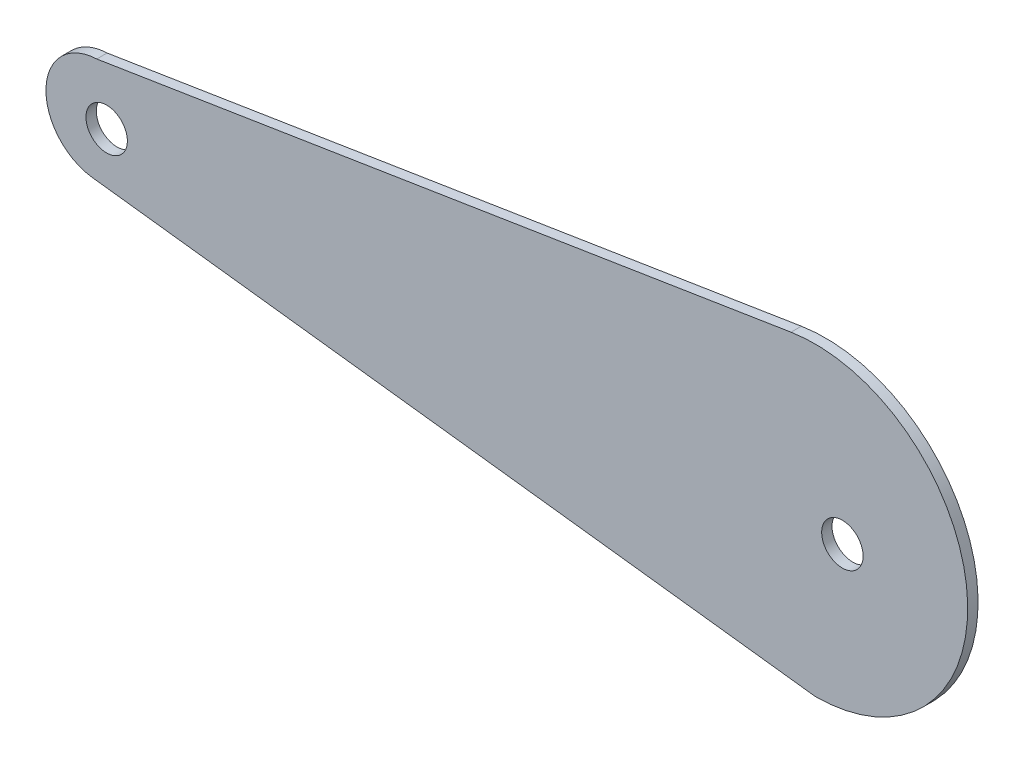
ISO-10303-21;
HEADER;
FILE_DESCRIPTION(('STEP AP214'),'2;1');
FILE_NAME('part.step','',(''),(''),'','','');
FILE_SCHEMA(('AUTOMOTIVE_DESIGN { 1 0 10303 214 1 1 1 1 }'));
ENDSEC;
DATA;
#1=APPLICATION_CONTEXT('core data for automotive mechanical design processes');
#2=APPLICATION_PROTOCOL_DEFINITION('international standard','automotive_design',2000,#1);
#3=PRODUCT_CONTEXT('',#1,'mechanical');
#4=PRODUCT('Part','Part','',(#3));
#5=PRODUCT_RELATED_PRODUCT_CATEGORY('part','',(#4));
#6=PRODUCT_DEFINITION_FORMATION('','',#4);
#7=PRODUCT_DEFINITION_CONTEXT('part definition',#1,'design');
#8=PRODUCT_DEFINITION('design','',#6,#7);
#9=PRODUCT_DEFINITION_SHAPE('','',#8);
#10=(LENGTH_UNIT() NAMED_UNIT(*) SI_UNIT(.MILLI.,.METRE.));
#11=(NAMED_UNIT(*) PLANE_ANGLE_UNIT() SI_UNIT($,.RADIAN.));
#12=(NAMED_UNIT(*) SI_UNIT($,.STERADIAN.) SOLID_ANGLE_UNIT());
#13=UNCERTAINTY_MEASURE_WITH_UNIT(LENGTH_MEASURE(1.E-05),#10,'distance_accuracy_value','');
#14=(GEOMETRIC_REPRESENTATION_CONTEXT(3) GLOBAL_UNCERTAINTY_ASSIGNED_CONTEXT((#13)) GLOBAL_UNIT_ASSIGNED_CONTEXT((#10,
#11,#12)) REPRESENTATION_CONTEXT('',''));
#15=CARTESIAN_POINT('',(0.,0.,0.));
#16=DIRECTION('',(0.,0.,1.));
#17=DIRECTION('',(1.,0.,0.));
#18=AXIS2_PLACEMENT_3D('',#15,#16,#17);
#19=CARTESIAN_POINT('',(-82.990021809514,-1.44597315914429,1.15));
#20=DIRECTION('',(0.,0.,-1.));
#21=DIRECTION('',(-1.,0.,0.));
#22=AXIS2_PLACEMENT_3D('',#19,#20,#21);
#23=CYLINDRICAL_SURFACE('',#22,6.604);
#24=CARTESIAN_POINT('',(-82.990021809514,-1.44597315914429,-0.15));
#25=DIRECTION('',(0.,0.,1.));
#26=DIRECTION('',(-1.,0.,0.));
#27=AXIS2_PLACEMENT_3D('',#24,#25,#26);
#28=CIRCLE('',#27,6.604);
#29=CARTESIAN_POINT('',(-83.2193163985339,5.15404502200083,-0.15));
#30=VERTEX_POINT('',#29);
#31=CARTESIAN_POINT('',(-83.7879593226111,-8.00158996652349,-0.15));
#32=VERTEX_POINT('',#31);
#33=EDGE_CURVE('E109',#30,#32,#28,.T.);
#34=ORIENTED_EDGE('',*,*,#33,.T.);
#35=DIRECTION('',(0.,0.,-1.));
#36=VECTOR('',#35,1.);
#37=CARTESIAN_POINT('',(-83.7879593226111,-8.00158996652349,1.15));
#38=LINE('',#37,#36);
#39=CARTESIAN_POINT('',(-83.7879593226111,-8.00158996652349,1.15));
#40=VERTEX_POINT('',#39);
#41=EDGE_CURVE('E11',#40,#32,#38,.T.);
#42=ORIENTED_EDGE('',*,*,#41,.F.);
#43=CARTESIAN_POINT('',(-82.990021809514,-1.44597315914429,1.15));
#44=DIRECTION('',(0.,0.,1.));
#45=DIRECTION('',(-1.,0.,0.));
#46=AXIS2_PLACEMENT_3D('',#43,#44,#45);
#47=CIRCLE('',#46,6.604);
#48=CARTESIAN_POINT('',(-83.2193163985339,5.15404502200083,1.15));
#49=VERTEX_POINT('',#48);
#50=EDGE_CURVE('E93',#49,#40,#47,.T.);
#51=ORIENTED_EDGE('',*,*,#50,.F.);
#52=DIRECTION('',(0.,0.,-1.));
#53=VECTOR('',#52,1.);
#54=CARTESIAN_POINT('',(-83.2193163985339,5.15404502200083,1.15));
#55=LINE('',#54,#53);
#56=EDGE_CURVE('E105',#49,#30,#55,.T.);
#57=ORIENTED_EDGE('',*,*,#56,.T.);
#58=EDGE_LOOP('',(#34,#42,#51,#57));
#59=FACE_BOUND('',#58,.T.);
#60=ADVANCED_FACE('F41',(#59),#23,.T.);
#61=CARTESIAN_POINT('',(6.89033425783157,-19.0387835971847,1.15));
#62=DIRECTION('',(0.120826395078291,0.992673653449302,0.));
#63=DIRECTION('',(-0.992673653449302,0.120826395078291,0.));
#64=AXIS2_PLACEMENT_3D('',#61,#62,#63);
#65=PLANE('',#64);
#66=DIRECTION('',(0.992673653449302,-0.120826395078291,0.));
#67=VECTOR('',#66,1.);
#68=CARTESIAN_POINT('',(6.89033425783157,-19.0387835971847,-0.15));
#69=LINE('',#68,#67);
#70=CARTESIAN_POINT('',(6.89033425783158,-19.0387835971846,-0.15));
#71=VERTEX_POINT('',#70);
#72=EDGE_CURVE('E98',#32,#71,#69,.T.);
#73=ORIENTED_EDGE('',*,*,#72,.T.);
#74=DIRECTION('',(0.,0.,-1.));
#75=VECTOR('',#74,1.);
#76=CARTESIAN_POINT('',(6.89033425783158,-19.0387835971846,1.15));
#77=LINE('',#76,#75);
#78=CARTESIAN_POINT('',(6.89033425783158,-19.0387835971846,1.15));
#79=VERTEX_POINT('',#78);
#80=EDGE_CURVE('E50',#79,#71,#77,.T.);
#81=ORIENTED_EDGE('',*,*,#80,.F.);
#82=DIRECTION('',(0.992673653449302,-0.120826395078291,0.));
#83=VECTOR('',#82,1.);
#84=CARTESIAN_POINT('',(6.89033425783157,-19.0387835971847,1.15));
#85=LINE('',#84,#83);
#86=EDGE_CURVE('E88',#40,#79,#85,.T.);
#87=ORIENTED_EDGE('',*,*,#86,.F.);
#88=ORIENTED_EDGE('',*,*,#41,.T.);
#89=EDGE_LOOP('',(#73,#81,#87,#88));
#90=FACE_BOUND('',#89,.T.);
#91=ADVANCED_FACE('F97',(#90),#65,.F.);
#92=CARTESIAN_POINT('',(6.89157090044771,0.111393892351247,1.15));
#93=DIRECTION('',(0.,0.,-1.));
#94=DIRECTION('',(-1.,0.,0.));
#95=AXIS2_PLACEMENT_3D('',#92,#93,#94);
#96=CYLINDRICAL_SURFACE('',#95,19.1501775294646);
#97=CARTESIAN_POINT('',(6.89157090044771,0.111393892351247,-0.15));
#98=DIRECTION('',(0.,0.,1.));
#99=DIRECTION('',(-1.,0.,0.));
#100=AXIS2_PLACEMENT_3D('',#97,#98,#99);
#101=CIRCLE('',#100,19.1501775294646);
#102=CARTESIAN_POINT('',(3.88013560908701,19.0233096307411,-0.15));
#103=VERTEX_POINT('',#102);
#104=EDGE_CURVE('E75',#71,#103,#101,.T.);
#105=ORIENTED_EDGE('',*,*,#104,.T.);
#106=DIRECTION('',(0.,0.,-1.));
#107=VECTOR('',#106,1.);
#108=CARTESIAN_POINT('',(3.88013560908701,19.0233096307411,1.15));
#109=LINE('',#108,#107);
#110=CARTESIAN_POINT('',(3.88013560908701,19.0233096307411,1.15));
#111=VERTEX_POINT('',#110);
#112=EDGE_CURVE('E100',#111,#103,#109,.T.);
#113=ORIENTED_EDGE('',*,*,#112,.F.);
#114=CARTESIAN_POINT('',(6.89157090044771,0.111393892351247,1.15));
#115=DIRECTION('',(0.,0.,1.));
#116=DIRECTION('',(-1.,0.,0.));
#117=AXIS2_PLACEMENT_3D('',#114,#115,#116);
#118=CIRCLE('',#117,19.1501775294646);
#119=EDGE_CURVE('E91',#79,#111,#118,.T.);
#120=ORIENTED_EDGE('',*,*,#119,.F.);
#121=ORIENTED_EDGE('',*,*,#80,.T.);
#122=EDGE_LOOP('',(#105,#113,#120,#121));
#123=FACE_BOUND('',#122,.T.);
#124=ADVANCED_FACE('F101',(#123),#96,.T.);
#125=CARTESIAN_POINT('',(-83.2193163985339,5.15404502200083,1.15));
#126=DIRECTION('',(0.157253648783532,-0.987558246355254,0.));
#127=DIRECTION('',(0.987558246355255,0.157253648783532,0.));
#128=AXIS2_PLACEMENT_3D('',#125,#126,#127);
#129=PLANE('',#128);
#130=DIRECTION('',(-0.987558246355255,-0.157253648783532,0.));
#131=VECTOR('',#130,1.);
#132=CARTESIAN_POINT('',(-83.2193163985339,5.15404502200083,-0.15));
#133=LINE('',#132,#131);
#134=EDGE_CURVE('E81',#103,#30,#133,.T.);
#135=ORIENTED_EDGE('',*,*,#134,.T.);
#136=ORIENTED_EDGE('',*,*,#56,.F.);
#137=DIRECTION('',(-0.987558246355255,-0.157253648783532,0.));
#138=VECTOR('',#137,1.);
#139=CARTESIAN_POINT('',(-83.2193163985339,5.15404502200083,1.15));
#140=LINE('',#139,#138);
#141=EDGE_CURVE('E58',#111,#49,#140,.T.);
#142=ORIENTED_EDGE('',*,*,#141,.F.);
#143=ORIENTED_EDGE('',*,*,#112,.T.);
#144=EDGE_LOOP('',(#135,#136,#142,#143));
#145=FACE_BOUND('',#144,.T.);
#146=ADVANCED_FACE('F123',(#145),#129,.F.);
#147=CARTESIAN_POINT('',(-82.990021809514,-1.44597315914429,1.15));
#148=DIRECTION('',(0.,0.,-1.));
#149=DIRECTION('',(-1.,0.,0.));
#150=AXIS2_PLACEMENT_3D('',#147,#148,#149);
#151=PLANE('',#150);
#152=CARTESIAN_POINT('',(10.319040677389,-0.788690369258933,1.15));
#153=DIRECTION('',(0.,0.,-1.));
#154=DIRECTION('',(-1.,0.,0.));
#155=AXIS2_PLACEMENT_3D('',#152,#153,#154);
#156=CIRCLE('',#155,2.6000000832);
#157=CARTESIAN_POINT('',(7.71904059418895,-0.788690369258933,1.15));
#158=VERTEX_POINT('',#157);
#159=EDGE_CURVE('E113',#158,#158,#156,.T.);
#160=ORIENTED_EDGE('',*,*,#159,.T.);
#161=EDGE_LOOP('',(#160));
#162=FACE_BOUND('',#161,.T.);
#163=CARTESIAN_POINT('',(-81.9789414522111,-1.83624663730207,1.15));
#164=DIRECTION('',(0.,0.,-1.));
#165=DIRECTION('',(-1.,0.,0.));
#166=AXIS2_PLACEMENT_3D('',#163,#164,#165);
#167=CIRCLE('',#166,2.60000008320001);
#168=CARTESIAN_POINT('',(-84.5789415354111,-1.83624663730207,1.15));
#169=VERTEX_POINT('',#168);
#170=EDGE_CURVE('E133',#169,#169,#167,.T.);
#171=ORIENTED_EDGE('',*,*,#170,.T.);
#172=EDGE_LOOP('',(#171));
#173=FACE_BOUND('',#172,.T.);
#174=ORIENTED_EDGE('',*,*,#50,.T.);
#175=ORIENTED_EDGE('',*,*,#86,.T.);
#176=ORIENTED_EDGE('',*,*,#119,.T.);
#177=ORIENTED_EDGE('',*,*,#141,.T.);
#178=EDGE_LOOP('',(#174,#175,#176,#177));
#179=FACE_BOUND('',#178,.T.);
#180=ADVANCED_FACE('F89',(#162,#173,#179),#151,.F.);
#181=CARTESIAN_POINT('',(-82.990021809514,-1.44597315914429,-0.15));
#182=DIRECTION('',(0.,0.,-1.));
#183=DIRECTION('',(-1.,0.,0.));
#184=AXIS2_PLACEMENT_3D('',#181,#182,#183);
#185=PLANE('',#184);
#186=CARTESIAN_POINT('',(10.319040677389,-0.788690369258933,-0.15));
#187=DIRECTION('',(0.,0.,-1.));
#188=DIRECTION('',(-1.,0.,0.));
#189=AXIS2_PLACEMENT_3D('',#186,#187,#188);
#190=CIRCLE('',#189,2.6000000832);
#191=CARTESIAN_POINT('',(7.71904059418895,-0.788690369258933,-0.15));
#192=VERTEX_POINT('',#191);
#193=EDGE_CURVE('E137',#192,#192,#190,.T.);
#194=ORIENTED_EDGE('',*,*,#193,.F.);
#195=EDGE_LOOP('',(#194));
#196=FACE_BOUND('',#195,.T.);
#197=CARTESIAN_POINT('',(-81.9789414522111,-1.83624663730207,-0.15));
#198=DIRECTION('',(0.,0.,-1.));
#199=DIRECTION('',(-1.,0.,0.));
#200=AXIS2_PLACEMENT_3D('',#197,#198,#199);
#201=CIRCLE('',#200,2.60000008320001);
#202=CARTESIAN_POINT('',(-84.5789415354111,-1.83624663730207,-0.15));
#203=VERTEX_POINT('',#202);
#204=EDGE_CURVE('E138',#203,#203,#201,.T.);
#205=ORIENTED_EDGE('',*,*,#204,.F.);
#206=EDGE_LOOP('',(#205));
#207=FACE_BOUND('',#206,.T.);
#208=ORIENTED_EDGE('',*,*,#33,.F.);
#209=ORIENTED_EDGE('',*,*,#134,.F.);
#210=ORIENTED_EDGE('',*,*,#104,.F.);
#211=ORIENTED_EDGE('',*,*,#72,.F.);
#212=EDGE_LOOP('',(#208,#209,#210,#211));
#213=FACE_BOUND('',#212,.T.);
#214=ADVANCED_FACE('F126',(#196,#207,#213),#185,.T.);
#215=CARTESIAN_POINT('',(-81.9789414522111,-1.83624663730207,3.152));
#216=DIRECTION('',(0.,0.,-1.));
#217=DIRECTION('',(-1.,0.,0.));
#218=AXIS2_PLACEMENT_3D('',#215,#216,#217);
#219=CYLINDRICAL_SURFACE('',#218,2.60000008320001);
#220=ORIENTED_EDGE('',*,*,#204,.T.);
#221=EDGE_LOOP('',(#220));
#222=FACE_BOUND('',#221,.T.);
#223=ORIENTED_EDGE('',*,*,#170,.F.);
#224=EDGE_LOOP('',(#223));
#225=FACE_BOUND('',#224,.T.);
#226=ADVANCED_FACE('F151',(#222,#225),#219,.F.);
#227=CARTESIAN_POINT('',(10.319040677389,-0.788690369258933,3.152));
#228=DIRECTION('',(0.,0.,-1.));
#229=DIRECTION('',(-1.,0.,0.));
#230=AXIS2_PLACEMENT_3D('',#227,#228,#229);
#231=CYLINDRICAL_SURFACE('',#230,2.6000000832);
#232=ORIENTED_EDGE('',*,*,#193,.T.);
#233=EDGE_LOOP('',(#232));
#234=FACE_BOUND('',#233,.T.);
#235=ORIENTED_EDGE('',*,*,#159,.F.);
#236=EDGE_LOOP('',(#235));
#237=FACE_BOUND('',#236,.T.);
#238=ADVANCED_FACE('F146',(#234,#237),#231,.F.);
#239=CLOSED_SHELL('',(#60,#91,#124,#146,#180,#214,#226,#238));
#240=MANIFOLD_SOLID_BREP('B2',#239);
#241=ADVANCED_BREP_SHAPE_REPRESENTATION('',(#18,#240),#14);
#242=SHAPE_DEFINITION_REPRESENTATION(#9,#241);
ENDSEC;
END-ISO-10303-21;
